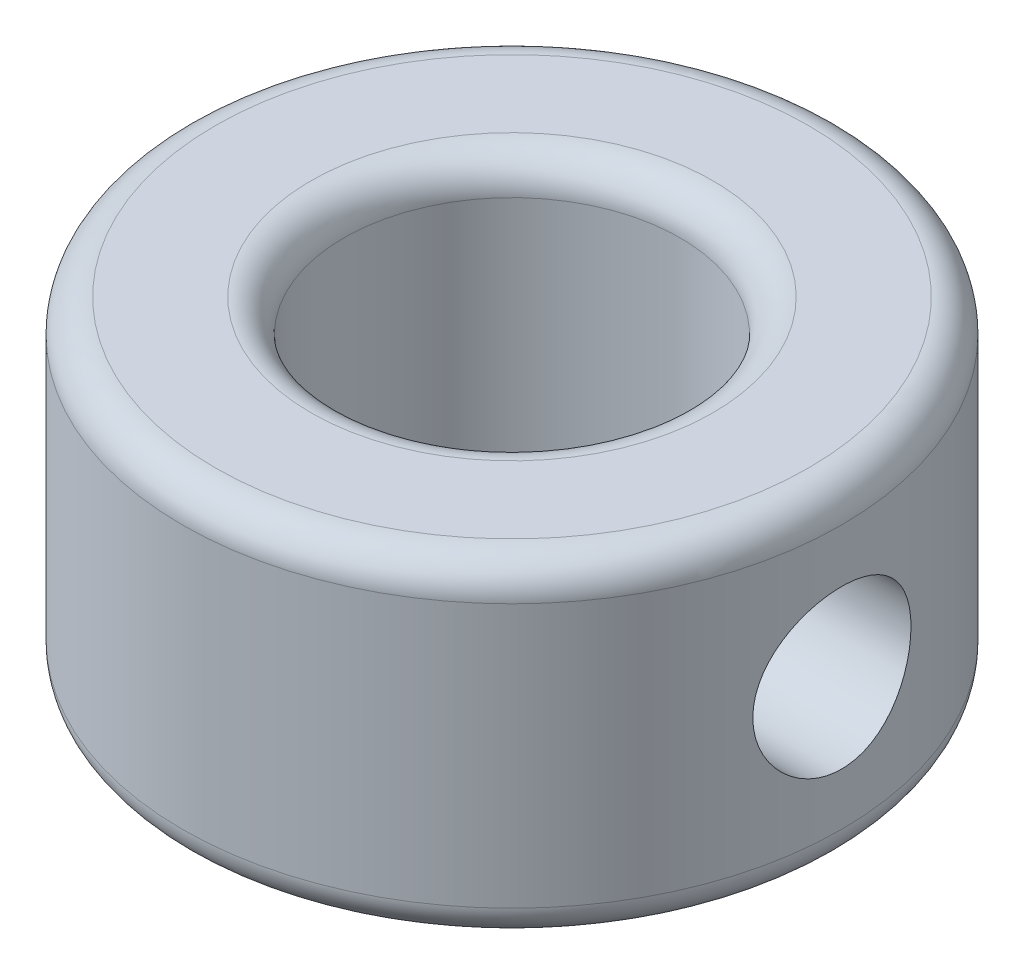
ISO-10303-21;
HEADER;
FILE_DESCRIPTION(('STEP AP214'),'2;1');
FILE_NAME('part.step','',(''),(''),'','','');
FILE_SCHEMA(('AUTOMOTIVE_DESIGN { 1 0 10303 214 1 1 1 1 }'));
ENDSEC;
DATA;
#1=APPLICATION_CONTEXT('core data for automotive mechanical design processes');
#2=APPLICATION_PROTOCOL_DEFINITION('international standard','automotive_design',2000,#1);
#3=PRODUCT_CONTEXT('',#1,'mechanical');
#4=PRODUCT('Part','Part','',(#3));
#5=PRODUCT_RELATED_PRODUCT_CATEGORY('part','',(#4));
#6=PRODUCT_DEFINITION_FORMATION('','',#4);
#7=PRODUCT_DEFINITION_CONTEXT('part definition',#1,'design');
#8=PRODUCT_DEFINITION('design','',#6,#7);
#9=PRODUCT_DEFINITION_SHAPE('','',#8);
#10=(LENGTH_UNIT() NAMED_UNIT(*) SI_UNIT(.MILLI.,.METRE.));
#11=(NAMED_UNIT(*) PLANE_ANGLE_UNIT() SI_UNIT($,.RADIAN.));
#12=(NAMED_UNIT(*) SI_UNIT($,.STERADIAN.) SOLID_ANGLE_UNIT());
#13=UNCERTAINTY_MEASURE_WITH_UNIT(LENGTH_MEASURE(1.E-05),#10,'distance_accuracy_value','');
#14=(GEOMETRIC_REPRESENTATION_CONTEXT(3) GLOBAL_UNCERTAINTY_ASSIGNED_CONTEXT((#13)) GLOBAL_UNIT_ASSIGNED_CONTEXT((#10,
#11,#12)) REPRESENTATION_CONTEXT('',''));
#15=CARTESIAN_POINT('',(0.,0.,0.));
#16=DIRECTION('',(0.,0.,1.));
#17=DIRECTION('',(1.,0.,0.));
#18=AXIS2_PLACEMENT_3D('',#15,#16,#17);
#19=CARTESIAN_POINT('',(0.,5.,0.));
#20=DIRECTION('',(0.,1.,0.));
#21=DIRECTION('',(0.,0.,1.));
#22=AXIS2_PLACEMENT_3D('',#19,#20,#21);
#23=PLANE('',#22);
#24=CARTESIAN_POINT('',(0.,5.,0.));
#25=DIRECTION('',(0.,1.,0.));
#26=DIRECTION('',(0.,0.,1.));
#27=AXIS2_PLACEMENT_3D('',#24,#25,#26);
#28=CIRCLE('',#27,3.05);
#29=CARTESIAN_POINT('',(0.,5.,3.05));
#30=VERTEX_POINT('',#29);
#31=EDGE_CURVE('E50',#30,#30,#28,.F.);
#32=ORIENTED_EDGE('',*,*,#31,.T.);
#33=EDGE_LOOP('',(#32));
#34=FACE_BOUND('',#33,.T.);
#35=CARTESIAN_POINT('',(0.,5.,0.));
#36=DIRECTION('',(0.,1.,0.));
#37=DIRECTION('',(0.,0.,1.));
#38=AXIS2_PLACEMENT_3D('',#35,#36,#37);
#39=CIRCLE('',#38,4.5);
#40=CARTESIAN_POINT('',(0.,5.,4.5));
#41=VERTEX_POINT('',#40);
#42=EDGE_CURVE('E55',#41,#41,#39,.T.);
#43=ORIENTED_EDGE('',*,*,#42,.T.);
#44=EDGE_LOOP('',(#43));
#45=FACE_BOUND('',#44,.T.);
#46=ADVANCED_FACE('F37',(#34,#45),#23,.T.);
#47=CARTESIAN_POINT('',(0.,0.,0.));
#48=DIRECTION('',(0.,1.,0.));
#49=DIRECTION('',(0.,0.,1.));
#50=AXIS2_PLACEMENT_3D('',#47,#48,#49);
#51=PLANE('',#50);
#52=CARTESIAN_POINT('',(0.,0.,0.));
#53=DIRECTION('',(0.,1.,0.));
#54=DIRECTION('',(0.,0.,1.));
#55=AXIS2_PLACEMENT_3D('',#52,#53,#54);
#56=CIRCLE('',#55,3.05);
#57=CARTESIAN_POINT('',(0.,0.,3.05));
#58=VERTEX_POINT('',#57);
#59=EDGE_CURVE('E78',#58,#58,#56,.T.);
#60=ORIENTED_EDGE('',*,*,#59,.T.);
#61=EDGE_LOOP('',(#60));
#62=FACE_BOUND('',#61,.T.);
#63=CARTESIAN_POINT('',(0.,0.,0.));
#64=DIRECTION('',(0.,1.,0.));
#65=DIRECTION('',(0.,0.,1.));
#66=AXIS2_PLACEMENT_3D('',#63,#64,#65);
#67=CIRCLE('',#66,4.5);
#68=CARTESIAN_POINT('',(0.,0.,4.5));
#69=VERTEX_POINT('',#68);
#70=EDGE_CURVE('E82',#69,#69,#67,.F.);
#71=ORIENTED_EDGE('',*,*,#70,.T.);
#72=EDGE_LOOP('',(#71));
#73=FACE_BOUND('',#72,.T.);
#74=ADVANCED_FACE('F108',(#62,#73),#51,.F.);
#75=CARTESIAN_POINT('',(0.,5.,0.));
#76=DIRECTION('',(0.,-1.,0.));
#77=DIRECTION('',(0.,0.,-1.));
#78=AXIS2_PLACEMENT_3D('',#75,#76,#77);
#79=CYLINDRICAL_SURFACE('',#78,5.);
#80=CARTESIAN_POINT('',(4.85386443980464,2.49174668869472,-1.20000000000002));
#81=CARTESIAN_POINT('',(4.85386574834955,2.4253921631182,-1.19999797055781));
#82=CARTESIAN_POINT('',(4.85523993119246,2.359014567966,-1.19447760630205));
#83=CARTESIAN_POINT('',(4.8605754799883,2.22815934760662,-1.17257348950945));
#84=CARTESIAN_POINT('',(4.86453847215855,2.16368294329946,-1.15618290850902));
#85=CARTESIAN_POINT('',(4.87457754147826,2.03854177053362,-1.11309435138137));
#86=CARTESIAN_POINT('',(4.88065102731291,1.97787243501714,-1.08640901099971));
#87=CARTESIAN_POINT('',(4.89422356910218,1.86186687123183,-1.02352620715789));
#88=CARTESIAN_POINT('',(4.90172265612421,1.8065307592269,-0.987328536393686));
#89=CARTESIAN_POINT('',(4.91747172337778,1.70163916271865,-0.905664368660592));
#90=CARTESIAN_POINT('',(4.92573292327146,1.65220782629891,-0.860040546351197));
#91=CARTESIAN_POINT('',(4.94197776786566,1.56162053092105,-0.7611583052635));
#92=CARTESIAN_POINT('',(4.94996138808951,1.52046530021768,-0.707899215326618));
#93=CARTESIAN_POINT('',(4.96487503831898,1.44709611561232,-0.594413740032994));
#94=CARTESIAN_POINT('',(4.9717902836032,1.41500327927501,-0.534106940562808));
#95=CARTESIAN_POINT('',(4.98366044385166,1.36145607376759,-0.408761457376216));
#96=CARTESIAN_POINT('',(4.98861562472599,1.34000026143659,-0.343723416936987));
#97=CARTESIAN_POINT('',(4.99592803621097,1.30873142694013,-0.212054861119581));
#98=CARTESIAN_POINT('',(4.99833220128179,1.29870780301144,-0.145477011016417));
#99=CARTESIAN_POINT('',(5.00043493925753,1.28992768081807,-0.0115442295903606));
#100=CARTESIAN_POINT('',(5.00013388201989,1.29116964232506,0.0558105942473063));
#101=CARTESIAN_POINT('',(4.99689534571203,1.30473216900872,0.187927678875501));
#102=CARTESIAN_POINT('',(4.99401193949727,1.31682552236215,0.252714787646825));
#103=CARTESIAN_POINT('',(4.98599518389802,1.35138338387987,0.379311966331691));
#104=CARTESIAN_POINT('',(4.98086172025245,1.37384841873586,0.441121884882375));
#105=CARTESIAN_POINT('',(4.96883750692918,1.42870142179384,0.560619403184042));
#106=CARTESIAN_POINT('',(4.9619322123624,1.46117199100209,0.618267562959172));
#107=CARTESIAN_POINT('',(4.94711614602281,1.53505206216124,0.72737749926026));
#108=CARTESIAN_POINT('',(4.93920521180944,1.57646300900403,0.778838273721475));
#109=CARTESIAN_POINT('',(4.92300938183712,1.66827284912857,0.875466704291552));
#110=CARTESIAN_POINT('',(4.91472008098886,1.71887043516232,0.920445028443123));
#111=CARTESIAN_POINT('',(4.89888404902298,1.82697694315808,1.00131821955701));
#112=CARTESIAN_POINT('',(4.89133734727315,1.88448613825595,1.03721272736708));
#113=CARTESIAN_POINT('',(4.87782644988181,2.0051327912,1.09900794525503));
#114=CARTESIAN_POINT('',(4.8718689814022,2.06829270912541,1.12486637653162));
#115=CARTESIAN_POINT('',(4.86229932919543,2.19823993808532,1.16554129726682));
#116=CARTESIAN_POINT('',(4.85868668784527,2.26502653856754,1.18035994136451));
#117=CARTESIAN_POINT('',(4.8543109065439,2.39858404071901,1.19822740093826));
#118=CARTESIAN_POINT('',(4.85348035194831,2.4653155176941,1.20155473331586));
#119=CARTESIAN_POINT('',(4.85457982488721,2.59837996632145,1.19710481364214));
#120=CARTESIAN_POINT('',(4.85650962025667,2.66471297101686,1.18932849548676));
#121=CARTESIAN_POINT('',(4.8628480607639,2.79408505560168,1.16313540811093));
#122=CARTESIAN_POINT('',(4.86721959037933,2.85715835906218,1.14487784593917));
#123=CARTESIAN_POINT('',(4.87791428510208,2.97934981696086,1.09841565995519));
#124=CARTESIAN_POINT('',(4.88423766714649,3.03846753086905,1.07020993041212));
#125=CARTESIAN_POINT('',(4.89826757064917,3.15225818957649,1.0040589747049));
#126=CARTESIAN_POINT('',(4.90599720896891,3.20683043829719,0.965945543261188));
#127=CARTESIAN_POINT('',(4.92191059520354,3.30890698225223,0.881276206441508));
#128=CARTESIAN_POINT('',(4.93009441150587,3.35641020908889,0.834719027249034));
#129=CARTESIAN_POINT('',(4.94622044561256,3.44411269253843,0.733211442050541));
#130=CARTESIAN_POINT('',(4.95415286604867,3.48412019109059,0.678093519796203));
#131=CARTESIAN_POINT('',(4.96868773599825,3.55431007392873,0.561759047226864));
#132=CARTESIAN_POINT('',(4.97529025311405,3.58449295767258,0.50054280714119));
#133=CARTESIAN_POINT('',(4.98638083813349,3.63392567960473,0.374162473013338));
#134=CARTESIAN_POINT('',(4.99088358502536,3.65325161690337,0.309029492813389));
#135=CARTESIAN_POINT('',(4.99733131235137,3.68065381685347,0.176319006648466));
#136=CARTESIAN_POINT('',(4.99927674530205,3.68873206979692,0.108741935340367));
#137=CARTESIAN_POINT('',(5.00037384681398,3.69330503580953,-0.0251309330151851));
#138=CARTESIAN_POINT('',(4.99959402361891,3.69008379107134,-0.0914166194368514));
#139=CARTESIAN_POINT('',(4.99547843914621,3.67279470348772,-0.222472635242514));
#140=CARTESIAN_POINT('',(4.99214274325726,3.65872713813132,-0.287243003350283));
#141=CARTESIAN_POINT('',(4.98329901613138,3.62029195864836,-0.413158134552182));
#142=CARTESIAN_POINT('',(4.97780105635323,3.5959720609181,-0.474318216072194));
#143=CARTESIAN_POINT('',(4.96521431839506,3.53776659103557,-0.59172364967638));
#144=CARTESIAN_POINT('',(4.95812535402571,3.50387989919731,-0.647968425469462));
#145=CARTESIAN_POINT('',(4.94292611630121,3.42661649898283,-0.755306804615834));
#146=CARTESIAN_POINT('',(4.93479656171731,3.38304466039304,-0.806257226493148));
#147=CARTESIAN_POINT('',(4.91852450984833,3.28803164446308,-0.900219806258476));
#148=CARTESIAN_POINT('',(4.91038200984689,3.23658851241606,-0.943229986447191));
#149=CARTESIAN_POINT('',(4.8948510255588,3.12625093101654,-1.02079794075126));
#150=CARTESIAN_POINT('',(4.88747753892749,3.06724564043551,-1.05520126657));
#151=CARTESIAN_POINT('',(4.87451638676983,2.94412195003553,-1.11354828361192));
#152=CARTESIAN_POINT('',(4.86892735049338,2.88000752241103,-1.13750000858817));
#153=CARTESIAN_POINT('',(4.86109564328101,2.76190954729884,-1.17045774554032));
#154=CARTESIAN_POINT('',(4.85840351753819,2.70851835741287,-1.18151294684133));
#155=CARTESIAN_POINT('',(4.8547874419015,2.60067213906377,-1.19628464477188));
#156=CARTESIAN_POINT('',(4.85386336561877,2.54621718692474,-1.2000016659712));
#157=CARTESIAN_POINT('',(4.85386443980464,2.49174668869472,-1.20000000000002));
#158=B_SPLINE_CURVE_WITH_KNOTS('',3,(#80,#81,#82,#83,#84,#85,#86,#87,#88,#89,#90,#91,#92,#93,
#94,#95,#96,#97,#98,#99,#100,#101,#102,#103,#104,#105,#106,#107,#108,#109,#110,#111,#112,#113,
#114,#115,#116,#117,#118,#119,#120,#121,#122,#123,#124,#125,#126,#127,#128,#129,#130,#131,#132,
#133,#134,#135,#136,#137,#138,#139,#140,#141,#142,#143,#144,#145,#146,#147,#148,#149,#150,#151,
#152,#153,#154,#155,#156,#157),.UNSPECIFIED.,.T.,.F.,(4,2,2,2,2,2,2,2,2,2,2,2,2,2,2,2,2,2,2,2,2,
2,2,2,2,2,2,2,2,2,2,2,2,2,2,2,2,2,4),(0.,0.198863684875773,0.39785241061556,0.596597671501018,
0.795347264039443,0.997729672776182,1.20012988233894,1.40511932306521,1.61008094456725,
1.81120251394427,2.01229658643974,2.20927584611689,2.40626510983779,2.60492628768565,
2.80361959606555,3.00727667386883,3.2109418025258,3.41545582890608,3.61992992974891,
3.81941198396488,4.01887726131023,4.2153899929423,4.41192457369419,4.61204261040561,
4.81219086190156,5.01691376492014,5.22162625873254,5.4248853716732,5.62810851308335,
5.82626011732859,6.02440665229056,6.2216409817018,6.41889840475701,6.6205634308204,
6.82227861861518,7.02738891173641,7.232341265356,7.39560033961484,7.55884774287673),.UNSPECIFIED.);
#159=CARTESIAN_POINT('',(4.85386443980464,2.49174668869472,-1.20000000000002));
#160=VERTEX_POINT('',#159);
#161=EDGE_CURVE('E10',#160,#160,#158,.T.);
#162=ORIENTED_EDGE('',*,*,#161,.T.);
#163=EDGE_LOOP('',(#162));
#164=FACE_BOUND('',#163,.T.);
#165=CARTESIAN_POINT('',(0.,0.5,0.));
#166=DIRECTION('',(0.,1.,0.));
#167=DIRECTION('',(0.,0.,1.));
#168=AXIS2_PLACEMENT_3D('',#165,#166,#167);
#169=CIRCLE('',#168,5.);
#170=CARTESIAN_POINT('',(0.,0.5,5.));
#171=VERTEX_POINT('',#170);
#172=EDGE_CURVE('E60',#171,#171,#169,.T.);
#173=ORIENTED_EDGE('',*,*,#172,.T.);
#174=EDGE_LOOP('',(#173));
#175=FACE_BOUND('',#174,.T.);
#176=CARTESIAN_POINT('',(0.,4.5,0.));
#177=DIRECTION('',(0.,1.,0.));
#178=DIRECTION('',(0.,0.,1.));
#179=AXIS2_PLACEMENT_3D('',#176,#177,#178);
#180=CIRCLE('',#179,5.);
#181=CARTESIAN_POINT('',(0.,4.5,5.));
#182=VERTEX_POINT('',#181);
#183=EDGE_CURVE('E66',#182,#182,#180,.F.);
#184=ORIENTED_EDGE('',*,*,#183,.T.);
#185=EDGE_LOOP('',(#184));
#186=FACE_BOUND('',#185,.T.);
#187=ADVANCED_FACE('F112',(#164,#175,#186),#79,.T.);
#188=CARTESIAN_POINT('',(0.,5.,0.));
#189=DIRECTION('',(0.,-1.,0.));
#190=DIRECTION('',(0.,0.,-1.));
#191=AXIS2_PLACEMENT_3D('',#188,#189,#190);
#192=CYLINDRICAL_SURFACE('',#191,2.55);
#193=CARTESIAN_POINT('',(2.25,2.49174668869472,-1.20000000000001));
#194=CARTESIAN_POINT('',(2.25000439757753,2.42866437451598,-1.1999962317967));
#195=CARTESIAN_POINT('',(2.25269229861563,2.36548996922833,-1.1949933579613));
#196=CARTESIAN_POINT('',(2.26306945698019,2.24103611613172,-1.17521670300663));
#197=CARTESIAN_POINT('',(2.27077042355108,2.17976145757061,-1.1604200447395));
#198=CARTESIAN_POINT('',(2.29008997377436,2.06113674192288,-1.12180529289805));
#199=CARTESIAN_POINT('',(2.30168954620787,2.00376923409166,-1.09803091022425));
#200=CARTESIAN_POINT('',(2.32747028116713,1.89385090144268,-1.04226797133731));
#201=CARTESIAN_POINT('',(2.34165131688999,1.84129984022893,-1.01027981855741));
#202=CARTESIAN_POINT('',(2.372259827784,1.73828097409951,-0.936268193996209));
#203=CARTESIAN_POINT('',(2.38877565323043,1.68824158493651,-0.893684656003645));
#204=CARTESIAN_POINT('',(2.42147571854437,1.59568765376382,-0.80086004398643));
#205=CARTESIAN_POINT('',(2.43765980535902,1.5531765188815,-0.750615521810282));
#206=CARTESIAN_POINT('',(2.46899851070961,1.47447939787296,-0.640324456266945));
#207=CARTESIAN_POINT('',(2.48403883993122,1.43880380786839,-0.579878231278907));
#208=CARTESIAN_POINT('',(2.51027356108069,1.37832017463649,-0.453003007466613));
#209=CARTESIAN_POINT('',(2.52147010862858,1.35350603807456,-0.386577388399388));
#210=CARTESIAN_POINT('',(2.53812310951959,1.31709202358255,-0.254153485592814));
#211=CARTESIAN_POINT('',(2.54390213972724,1.30474557349173,-0.188401946861502));
#212=CARTESIAN_POINT('',(2.55026115433398,1.29117588589954,-0.0555249734532854));
#213=CARTESIAN_POINT('',(2.55084388226907,1.28994677867502,0.011599717461936));
#214=CARTESIAN_POINT('',(2.54691160023003,1.29831975684458,0.139774644432179));
#215=CARTESIAN_POINT('',(2.54278689796313,1.30709249942972,0.200893574274707));
#216=CARTESIAN_POINT('',(2.53047330329296,1.33375940531811,0.320672270879069));
#217=CARTESIAN_POINT('',(2.52228410888415,1.35165424642688,0.379331854551853));
#218=CARTESIAN_POINT('',(2.50245388711616,1.39622020612431,0.493599358821051));
#219=CARTESIAN_POINT('',(2.49076348560633,1.4230175015093,0.549149145446152));
#220=CARTESIAN_POINT('',(2.46501791334744,1.4844774959594,0.655106113702048));
#221=CARTESIAN_POINT('',(2.45096187661905,1.51914307696476,0.70551140121094));
#222=CARTESIAN_POINT('',(2.42040914398785,1.59880350530453,0.804376884722743));
#223=CARTESIAN_POINT('',(2.40380650618085,1.64443106162703,0.852295108137162));
#224=CARTESIAN_POINT('',(2.37085779289851,1.74299866930989,0.940072276192107));
#225=CARTESIAN_POINT('',(2.3545118818547,1.79594321018896,0.979926235521173));
#226=CARTESIAN_POINT('',(2.32304967293174,1.9109965338772,1.05241774649633));
#227=CARTESIAN_POINT('',(2.3080392761965,1.97343585747881,1.08458097319442));
#228=CARTESIAN_POINT('',(2.2823242343538,2.10372579736694,1.13770677325469));
#229=CARTESIAN_POINT('',(2.27161556922209,2.17157129011488,1.15867981004061));
#230=CARTESIAN_POINT('',(2.25680676198448,2.30532900626018,1.18725119238463));
#231=CARTESIAN_POINT('',(2.25226930021023,2.37100142273836,1.19573858589447));
#232=CARTESIAN_POINT('',(2.24906317130268,2.50297469809717,1.20176135710831));
#233=CARTESIAN_POINT('',(2.25039132107596,2.56927519664747,1.19930267491712));
#234=CARTESIAN_POINT('',(2.25830616241533,2.69419238260653,1.18431838064758));
#235=CARTESIAN_POINT('',(2.26440132069252,2.75295765397477,1.17273305724836));
#236=CARTESIAN_POINT('',(2.28047286471273,2.86762391222182,1.14116379454302));
#237=CARTESIAN_POINT('',(2.29045034922899,2.92352408314857,1.12117747746496));
#238=CARTESIAN_POINT('',(2.3137115038393,3.033782823405,1.07238008297615));
#239=CARTESIAN_POINT('',(2.32712643075022,3.08795139644465,1.04320452489768));
#240=CARTESIAN_POINT('',(2.35560892105515,3.19092238049978,0.977188908086642));
#241=CARTESIAN_POINT('',(2.37067730455877,3.23972210433189,0.940345037695285));
#242=CARTESIAN_POINT('',(2.40274557774552,3.33612440434737,0.85533178626607));
#243=CARTESIAN_POINT('',(2.41977701865017,3.38301709126842,0.806365774993761));
#244=CARTESIAN_POINT('',(2.45239370919886,3.46810783463712,0.700933929431724));
#245=CARTESIAN_POINT('',(2.46797863541086,3.506303949344,0.64446642468213));
#246=CARTESIAN_POINT('',(2.49629025584019,3.57336831014634,0.524308638386975));
#247=CARTESIAN_POINT('',(2.50896761373218,3.60207874265124,0.460517870501424));
#248=CARTESIAN_POINT('',(2.52966808523167,3.64809716630832,0.328247186565253));
#249=CARTESIAN_POINT('',(2.5376948093599,3.66541400430058,0.259770954382314));
#250=CARTESIAN_POINT('',(2.54767304766678,3.68682741996156,0.126322022326946));
#251=CARTESIAN_POINT('',(2.55008062045929,3.6919174983934,0.0615422390770661));
#252=CARTESIAN_POINT('',(2.5499153243921,3.69156726165317,-0.0679737969854525));
#253=CARTESIAN_POINT('',(2.54734382435069,3.68612984064123,-0.132710056869003));
#254=CARTESIAN_POINT('',(2.53777244750024,3.66557131716145,-0.256652903083346));
#255=CARTESIAN_POINT('',(2.53101865006603,3.65098778545383,-0.315969491274082));
#256=CARTESIAN_POINT('',(2.51394615085521,3.61322254985743,-0.431245443335737));
#257=CARTESIAN_POINT('',(2.50362687786594,3.59003946822033,-0.487204267583805));
#258=CARTESIAN_POINT('',(2.4797982075765,3.53460471074979,-0.59699163030976));
#259=CARTESIAN_POINT('',(2.46616576515944,3.50199070172003,-0.650609763286053));
#260=CARTESIAN_POINT('',(2.43721238765164,3.429095371328,-0.751846187966192));
#261=CARTESIAN_POINT('',(2.42189068935062,3.38881057825959,-0.799461746695227));
#262=CARTESIAN_POINT('',(2.38952535449274,3.29754435805353,-0.891778303891807));
#263=CARTESIAN_POINT('',(2.37244962506488,3.24593074407161,-0.935845054903607));
#264=CARTESIAN_POINT('',(2.33973594211898,3.13566592415868,-1.01487460404835));
#265=CARTESIAN_POINT('',(2.32409903783171,3.07700965325399,-1.04983079201856));
#266=CARTESIAN_POINT('',(2.2959855179539,2.95299316814014,-1.10998843501252));
#267=CARTESIAN_POINT('',(2.28356107867702,2.88754389409098,-1.13503197352042));
#268=CARTESIAN_POINT('',(2.2641034944279,2.75264831411626,-1.17337588350698));
#269=CARTESIAN_POINT('',(2.25705226017635,2.68321627310981,-1.18671567963818));
#270=CARTESIAN_POINT('',(2.25218371000614,2.5929572038348,-1.19589712813572));
#271=CARTESIAN_POINT('',(2.25136700833227,2.57275769693911,-1.19743384680036));
#272=CARTESIAN_POINT('',(2.25027443322611,2.53229086341671,-1.19948591353373));
#273=CARTESIAN_POINT('',(2.24999858646598,2.5120235334947,-1.20000121123131));
#274=CARTESIAN_POINT('',(2.25,2.49174668869472,-1.20000000000001));
#275=B_SPLINE_CURVE_WITH_KNOTS('',3,(#193,#194,#195,#196,#197,#198,#199,#200,#201,#202,#203,
#204,#205,#206,#207,#208,#209,#210,#211,#212,#213,#214,#215,#216,#217,#218,#219,#220,#221,#222,
#223,#224,#225,#226,#227,#228,#229,#230,#231,#232,#233,#234,#235,#236,#237,#238,#239,#240,#241,
#242,#243,#244,#245,#246,#247,#248,#249,#250,#251,#252,#253,#254,#255,#256,#257,#258,#259,#260,
#261,#262,#263,#264,#265,#266,#267,#268,#269,#270,#271,#272,#273,#274),.UNSPECIFIED.,.T.,.F.,(4,
2,2,2,2,2,2,2,2,2,2,2,2,2,2,2,2,2,2,2,2,2,2,2,2,2,2,2,2,2,2,2,2,2,2,2,2,2,2,2,4),(0.,
0.189161719336636,0.378766865349208,0.567460518367495,0.756144905149145,0.958531416535914,
1.16100929094848,1.37524041453039,1.58935119876262,1.7897055711902,1.9899541545453,
2.17473413789215,2.35952785307388,2.54706116695273,2.73466328037395,2.93843267778078,
3.14232766271941,3.35666874983971,3.57080906381766,3.76880673550512,3.96669697293462,
4.14650697587889,4.32636790558171,4.51452388494081,4.70277361459998,4.91153637112879,
5.12034569387844,5.33247199726689,5.544433394912,5.73848332720168,5.93247991996505,
6.11602343086412,6.29959636028643,6.49146143443702,6.68341355174061,6.89241042408558,
7.10155851446701,7.31391596373816,7.52555529887094,7.58635544130637,7.64715858201262),.UNSPECIFIED.);
#276=CARTESIAN_POINT('',(2.25,2.49174668869472,-1.20000000000001));
#277=VERTEX_POINT('',#276);
#278=EDGE_CURVE('E86',#277,#277,#275,.T.);
#279=ORIENTED_EDGE('',*,*,#278,.F.);
#280=EDGE_LOOP('',(#279));
#281=FACE_BOUND('',#280,.T.);
#282=CARTESIAN_POINT('',(0.,0.5,0.));
#283=DIRECTION('',(0.,1.,0.));
#284=DIRECTION('',(0.,0.,1.));
#285=AXIS2_PLACEMENT_3D('',#282,#283,#284);
#286=CIRCLE('',#285,2.55);
#287=CARTESIAN_POINT('',(0.,0.5,2.55));
#288=VERTEX_POINT('',#287);
#289=EDGE_CURVE('E70',#288,#288,#286,.F.);
#290=ORIENTED_EDGE('',*,*,#289,.T.);
#291=EDGE_LOOP('',(#290));
#292=FACE_BOUND('',#291,.T.);
#293=CARTESIAN_POINT('',(0.,4.5,0.));
#294=DIRECTION('',(0.,1.,0.));
#295=DIRECTION('',(0.,0.,1.));
#296=AXIS2_PLACEMENT_3D('',#293,#294,#295);
#297=CIRCLE('',#296,2.55);
#298=CARTESIAN_POINT('',(0.,4.5,2.55));
#299=VERTEX_POINT('',#298);
#300=EDGE_CURVE('E74',#299,#299,#297,.T.);
#301=ORIENTED_EDGE('',*,*,#300,.T.);
#302=EDGE_LOOP('',(#301));
#303=FACE_BOUND('',#302,.T.);
#304=ADVANCED_FACE('F93',(#281,#292,#303),#192,.F.);
#305=CARTESIAN_POINT('',(0.,0.5,0.));
#306=DIRECTION('',(0.,1.,0.));
#307=DIRECTION('',(0.,0.,1.));
#308=AXIS2_PLACEMENT_3D('',#305,#306,#307);
#309=TOROIDAL_SURFACE('',#308,3.05,0.5);
#310=ORIENTED_EDGE('',*,*,#289,.F.);
#311=EDGE_LOOP('',(#310));
#312=FACE_BOUND('',#311,.T.);
#313=ORIENTED_EDGE('',*,*,#59,.F.);
#314=EDGE_LOOP('',(#313));
#315=FACE_BOUND('',#314,.T.);
#316=ADVANCED_FACE('F119',(#312,#315),#309,.T.);
#317=CARTESIAN_POINT('',(0.,0.5,0.));
#318=DIRECTION('',(0.,1.,0.));
#319=DIRECTION('',(0.,0.,1.));
#320=AXIS2_PLACEMENT_3D('',#317,#318,#319);
#321=TOROIDAL_SURFACE('',#320,4.5,0.5);
#322=ORIENTED_EDGE('',*,*,#70,.F.);
#323=EDGE_LOOP('',(#322));
#324=FACE_BOUND('',#323,.T.);
#325=ORIENTED_EDGE('',*,*,#172,.F.);
#326=EDGE_LOOP('',(#325));
#327=FACE_BOUND('',#326,.T.);
#328=ADVANCED_FACE('F122',(#324,#327),#321,.T.);
#329=CARTESIAN_POINT('',(0.,4.5,0.));
#330=DIRECTION('',(0.,1.,0.));
#331=DIRECTION('',(0.,0.,1.));
#332=AXIS2_PLACEMENT_3D('',#329,#330,#331);
#333=TOROIDAL_SURFACE('',#332,3.05,0.5);
#334=ORIENTED_EDGE('',*,*,#31,.F.);
#335=EDGE_LOOP('',(#334));
#336=FACE_BOUND('',#335,.T.);
#337=ORIENTED_EDGE('',*,*,#300,.F.);
#338=EDGE_LOOP('',(#337));
#339=FACE_BOUND('',#338,.T.);
#340=ADVANCED_FACE('F104',(#336,#339),#333,.T.);
#341=CARTESIAN_POINT('',(0.,4.5,0.));
#342=DIRECTION('',(0.,1.,0.));
#343=DIRECTION('',(0.,0.,1.));
#344=AXIS2_PLACEMENT_3D('',#341,#342,#343);
#345=TOROIDAL_SURFACE('',#344,4.5,0.5);
#346=ORIENTED_EDGE('',*,*,#183,.F.);
#347=EDGE_LOOP('',(#346));
#348=FACE_BOUND('',#347,.T.);
#349=ORIENTED_EDGE('',*,*,#42,.F.);
#350=EDGE_LOOP('',(#349));
#351=FACE_BOUND('',#350,.T.);
#352=ADVANCED_FACE('F39',(#348,#351),#345,.T.);
#353=CARTESIAN_POINT('',(5.,2.49174668869472,0.));
#354=DIRECTION('',(1.,0.,0.));
#355=DIRECTION('',(0.,0.,-1.));
#356=AXIS2_PLACEMENT_3D('',#353,#354,#355);
#357=CYLINDRICAL_SURFACE('',#356,1.2);
#358=ORIENTED_EDGE('',*,*,#278,.T.);
#359=EDGE_LOOP('',(#358));
#360=FACE_BOUND('',#359,.T.);
#361=ORIENTED_EDGE('',*,*,#161,.F.);
#362=EDGE_LOOP('',(#361));
#363=FACE_BOUND('',#362,.T.);
#364=ADVANCED_FACE('F96',(#360,#363),#357,.F.);
#365=CLOSED_SHELL('',(#46,#74,#187,#304,#316,#328,#340,#352,#364));
#366=MANIFOLD_SOLID_BREP('B2',#365);
#367=ADVANCED_BREP_SHAPE_REPRESENTATION('',(#18,#366),#14);
#368=SHAPE_DEFINITION_REPRESENTATION(#9,#367);
ENDSEC;
END-ISO-10303-21;
